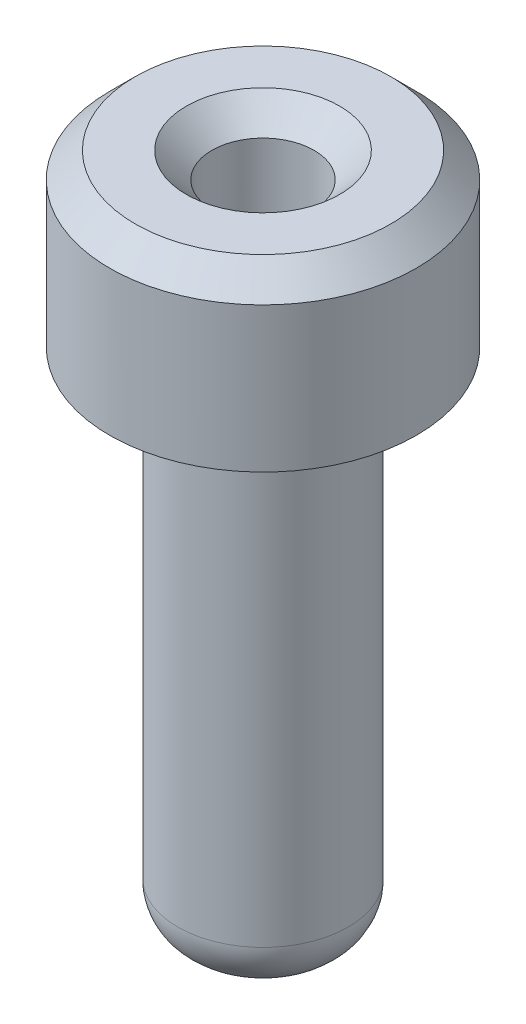
ISO-10303-21;
HEADER;
FILE_DESCRIPTION(('STEP AP214'),'2;1');
FILE_NAME('part.step','',(''),(''),'','','');
FILE_SCHEMA(('AUTOMOTIVE_DESIGN { 1 0 10303 214 1 1 1 1 }'));
ENDSEC;
DATA;
#1=APPLICATION_CONTEXT('core data for automotive mechanical design processes');
#2=APPLICATION_PROTOCOL_DEFINITION('international standard','automotive_design',2000,#1);
#3=PRODUCT_CONTEXT('',#1,'mechanical');
#4=PRODUCT('Part','Part','',(#3));
#5=PRODUCT_RELATED_PRODUCT_CATEGORY('part','',(#4));
#6=PRODUCT_DEFINITION_FORMATION('','',#4);
#7=PRODUCT_DEFINITION_CONTEXT('part definition',#1,'design');
#8=PRODUCT_DEFINITION('design','',#6,#7);
#9=PRODUCT_DEFINITION_SHAPE('','',#8);
#10=(LENGTH_UNIT() NAMED_UNIT(*) SI_UNIT(.MILLI.,.METRE.));
#11=(NAMED_UNIT(*) PLANE_ANGLE_UNIT() SI_UNIT($,.RADIAN.));
#12=(NAMED_UNIT(*) SI_UNIT($,.STERADIAN.) SOLID_ANGLE_UNIT());
#13=UNCERTAINTY_MEASURE_WITH_UNIT(LENGTH_MEASURE(1.E-05),#10,'distance_accuracy_value','');
#14=(GEOMETRIC_REPRESENTATION_CONTEXT(3) GLOBAL_UNCERTAINTY_ASSIGNED_CONTEXT((#13)) GLOBAL_UNIT_ASSIGNED_CONTEXT((#10,
#11,#12)) REPRESENTATION_CONTEXT('',''));
#15=CARTESIAN_POINT('',(0.,0.,0.));
#16=DIRECTION('',(0.,0.,1.));
#17=DIRECTION('',(1.,0.,0.));
#18=AXIS2_PLACEMENT_3D('',#15,#16,#17);
#19=CARTESIAN_POINT('',(0.9,-4.,0.));
#20=DIRECTION('',(0.,-1.,0.));
#21=DIRECTION('',(0.,0.,-1.));
#22=AXIS2_PLACEMENT_3D('',#19,#20,#21);
#23=PLANE('',#22);
#24=CARTESIAN_POINT('',(0.9,-4.,0.));
#25=DIRECTION('',(0.,-1.,0.));
#26=DIRECTION('',(-1.,0.,0.));
#27=AXIS2_PLACEMENT_3D('',#24,#25,#26);
#28=CIRCLE('',#27,0.2);
#29=CARTESIAN_POINT('',(0.900000000000413,-4.,-0.2));
#30=VERTEX_POINT('',#29);
#31=EDGE_CURVE('E11',#30,#30,#28,.T.);
#32=ORIENTED_EDGE('',*,*,#31,.T.);
#33=EDGE_LOOP('',(#32));
#34=FACE_BOUND('',#33,.T.);
#35=ADVANCED_FACE('F17',(#34),#23,.T.);
#36=CARTESIAN_POINT('',(0.900000000000413,-4.0000000000002,-0.199999999999386));
#37=CARTESIAN_POINT('',(0.700000000000896,-4.00000000000039,-0.199999999999386));
#38=CARTESIAN_POINT('',(0.700000000000896,-4.00000000000042,1.31884857368891E-13));
#39=CARTESIAN_POINT('',(0.700000000000896,-4.00000000000044,0.199999999999649));
#40=CARTESIAN_POINT('',(0.900000000000413,-4.00000000000025,0.19999999999965));
#41=CARTESIAN_POINT('',(1.09999999999993,-4.00000000000006,0.199999999999649));
#42=CARTESIAN_POINT('',(1.09999999999993,-4.,1.31884857368941E-13));
#43=CARTESIAN_POINT('',(1.09999999999993,-4.00000000000001,-0.199999999999386));
#44=CARTESIAN_POINT('',(0.900000000000413,-4.0000000000002,-0.199999999999386));
#45=CARTESIAN_POINT('',(0.900000000000413,-4.00000000000058,-0.500000000000546));
#46=CARTESIAN_POINT('',(0.399999999999736,-4.00000000000106,-0.500000000000545));
#47=CARTESIAN_POINT('',(0.399999999999736,-4.00000000000113,1.31884857368798E-13));
#48=CARTESIAN_POINT('',(0.399999999999736,-4.00000000000119,0.500000000000809));
#49=CARTESIAN_POINT('',(0.900000000000413,-4.00000000000071,0.500000000000809));
#50=CARTESIAN_POINT('',(1.40000000000109,-4.00000000000024,0.500000000000809));
#51=CARTESIAN_POINT('',(1.40000000000109,-4.00000000000017,1.31884857368924E-13));
#52=CARTESIAN_POINT('',(1.40000000000109,-4.0000000000001,-0.500000000000545));
#53=CARTESIAN_POINT('',(0.900000000000413,-4.00000000000058,-0.500000000000546));
#54=CARTESIAN_POINT('',(0.900000000000126,-3.69999999999942,-0.500000000000018));
#55=CARTESIAN_POINT('',(0.399999999999937,-3.6999999999999,-0.500000000000018));
#56=CARTESIAN_POINT('',(0.399999999999937,-3.7,1.71043734731314E-13));
#57=CARTESIAN_POINT('',(0.399999999999937,-3.70000000000003,0.50000000000036));
#58=CARTESIAN_POINT('',(0.900000000000126,-3.69999999999955,0.500000000000361));
#59=CARTESIAN_POINT('',(1.40000000000032,-3.69999999999908,0.50000000000036));
#60=CARTESIAN_POINT('',(1.40000000000032,-3.69999999999901,1.7104373473144E-13));
#61=CARTESIAN_POINT('',(1.40000000000032,-3.69999999999894,-0.500000000000018));
#62=CARTESIAN_POINT('',(0.900000000000126,-3.69999999999942,-0.500000000000018));
#63=(BOUNDED_SURFACE() B_SPLINE_SURFACE(2,2,((#36,#37,#38,#39,#40,#41,#42,#43,#44),(#45,#46,#47,
#48,#49,#50,#51,#52,#53),(#54,#55,#56,#57,#58,#59,#60,#61,#62)),.UNSPECIFIED.,.F.,.T.,
.F.) B_SPLINE_SURFACE_WITH_KNOTS((3,3),(3,2,2,2,3),(-1.5707963267963,1.62738730608672E-12),
(-3.14159265358979,-1.5707963267949,0.,1.5707963267949,3.14159265358979),
.UNSPECIFIED.) GEOMETRIC_REPRESENTATION_ITEM() RATIONAL_B_SPLINE_SURFACE(((1.,0.707106781186548,
1.,0.707106781186548,1.,0.707106781186548,1.,0.707106781186548,1.),(0.70710678118548,
0.499999999999245,0.70710678118548,0.499999999999245,0.70710678118548,0.499999999999245,
0.70710678118548,0.499999999999245,0.70710678118548),(1.,0.707106781186548,1.,0.707106781186548,
1.,0.707106781186548,1.,0.707106781186548,1.))) REPRESENTATION_ITEM('') SURFACE());
#64=CARTESIAN_POINT('',(0.9,-3.7,0.));
#65=DIRECTION('',(0.,-1.,0.));
#66=DIRECTION('',(-1.,0.,0.));
#67=AXIS2_PLACEMENT_3D('',#64,#65,#66);
#68=CIRCLE('',#67,0.5);
#69=CARTESIAN_POINT('',(1.4,-3.7,0.));
#70=VERTEX_POINT('',#69);
#71=CARTESIAN_POINT('',(0.900000000000126,-3.7,-0.5));
#72=VERTEX_POINT('',#71);
#73=EDGE_CURVE('E120',#70,#72,#68,.T.);
#74=CARTESIAN_POINT('',(0.900000000000126,-3.69999999999995,-0.199999999999768));
#75=DIRECTION('',(-1.,-9.55879451963443E-13,0.));
#76=DIRECTION('',(0.,1.31006316905719E-13,-1.));
#77=AXIS2_PLACEMENT_3D('',#74,#75,#76);
#78=CIRCLE('',#77,0.30000000000025);
#79=EDGE_CURVE('E27',#72,#30,#78,.T.);
#80=CARTESIAN_POINT('',(0.9,-3.7,0.));
#81=DIRECTION('',(0.,-1.,0.));
#82=DIRECTION('',(-1.,0.,0.));
#83=AXIS2_PLACEMENT_3D('',#80,#81,#82);
#84=CIRCLE('',#83,0.5);
#85=EDGE_CURVE('E101',#72,#70,#84,.T.);
#86=ORIENTED_EDGE('',*,*,#73,.T.);
#87=ORIENTED_EDGE('',*,*,#79,.T.);
#88=ORIENTED_EDGE('',*,*,#31,.F.);
#89=ORIENTED_EDGE('',*,*,#79,.F.);
#90=ORIENTED_EDGE('',*,*,#85,.T.);
#91=EDGE_LOOP('',(#86,#87,#88,#89,#90));
#92=FACE_BOUND('',#91,.T.);
#93=ADVANCED_FACE('F153',(#92),#63,.F.);
#94=CARTESIAN_POINT('',(0.9,0.2,0.));
#95=DIRECTION('',(0.,-1.,0.));
#96=DIRECTION('',(-1.,0.,0.));
#97=AXIS2_PLACEMENT_3D('',#94,#95,#96);
#98=CYLINDRICAL_SURFACE('',#97,0.5);
#99=ORIENTED_EDGE('',*,*,#73,.F.);
#100=DIRECTION('',(0.,1.,0.));
#101=VECTOR('',#100,1.);
#102=CARTESIAN_POINT('',(1.4,0.2,0.));
#103=LINE('',#102,#101);
#104=CARTESIAN_POINT('',(1.4,-1.,0.));
#105=VERTEX_POINT('',#104);
#106=EDGE_CURVE('E124',#70,#105,#103,.T.);
#107=ORIENTED_EDGE('',*,*,#106,.T.);
#108=CARTESIAN_POINT('',(0.9,-1.,0.));
#109=DIRECTION('',(0.,-1.,0.));
#110=DIRECTION('',(-1.,0.,0.));
#111=AXIS2_PLACEMENT_3D('',#108,#109,#110);
#112=CIRCLE('',#111,0.5);
#113=EDGE_CURVE('E114',#105,#105,#112,.T.);
#114=ORIENTED_EDGE('',*,*,#113,.T.);
#115=ORIENTED_EDGE('',*,*,#106,.F.);
#116=ORIENTED_EDGE('',*,*,#85,.F.);
#117=EDGE_LOOP('',(#99,#107,#114,#115,#116));
#118=FACE_BOUND('',#117,.T.);
#119=ADVANCED_FACE('F158',(#118),#98,.T.);
#120=CARTESIAN_POINT('',(0.9,-1.,0.));
#121=DIRECTION('',(0.,-1.,0.));
#122=DIRECTION('',(0.,0.,-1.));
#123=AXIS2_PLACEMENT_3D('',#120,#121,#122);
#124=PLANE('',#123);
#125=ORIENTED_EDGE('',*,*,#113,.F.);
#126=EDGE_LOOP('',(#125));
#127=FACE_BOUND('',#126,.T.);
#128=CARTESIAN_POINT('',(0.9,-1.,0.));
#129=DIRECTION('',(0.,1.,0.));
#130=DIRECTION('',(-1.,0.,0.));
#131=AXIS2_PLACEMENT_3D('',#128,#129,#130);
#132=CIRCLE('',#131,0.9);
#133=CARTESIAN_POINT('',(1.8,-1.,0.));
#134=VERTEX_POINT('',#133);
#135=EDGE_CURVE('E86',#134,#134,#132,.T.);
#136=ORIENTED_EDGE('',*,*,#135,.F.);
#137=EDGE_LOOP('',(#136));
#138=FACE_BOUND('',#137,.T.);
#139=ADVANCED_FACE('F161',(#127,#138),#124,.T.);
#140=CARTESIAN_POINT('',(0.9,-3.195331965159,0.));
#141=DIRECTION('',(0.,-1.,0.));
#142=DIRECTION('',(0.,0.,-1.));
#143=AXIS2_PLACEMENT_3D('',#140,#141,#142);
#144=PLANE('',#143);
#145=CARTESIAN_POINT('',(0.9,-3.195331965159,0.));
#146=DIRECTION('',(0.,-1.,0.));
#147=DIRECTION('',(-1.,0.,0.));
#148=AXIS2_PLACEMENT_3D('',#145,#146,#147);
#149=CIRCLE('',#148,0.3);
#150=CARTESIAN_POINT('',(1.2,-3.195331965159,0.));
#151=VERTEX_POINT('',#150);
#152=EDGE_CURVE('E111',#151,#151,#149,.T.);
#153=ORIENTED_EDGE('',*,*,#152,.F.);
#154=EDGE_LOOP('',(#153));
#155=FACE_BOUND('',#154,.T.);
#156=ADVANCED_FACE('F164',(#155),#144,.F.);
#157=CARTESIAN_POINT('',(0.9,0.2,0.));
#158=DIRECTION('',(0.,-1.,0.));
#159=DIRECTION('',(-1.,0.,0.));
#160=AXIS2_PLACEMENT_3D('',#157,#158,#159);
#161=CYLINDRICAL_SURFACE('',#160,0.3);
#162=CARTESIAN_POINT('',(0.9,-0.15,0.));
#163=DIRECTION('',(0.,-1.,0.));
#164=DIRECTION('',(-1.,0.,0.));
#165=AXIS2_PLACEMENT_3D('',#162,#163,#164);
#166=CIRCLE('',#165,0.3);
#167=CARTESIAN_POINT('',(1.2,-0.15,0.));
#168=VERTEX_POINT('',#167);
#169=CARTESIAN_POINT('',(0.6,-0.15,0.));
#170=VERTEX_POINT('',#169);
#171=EDGE_CURVE('E115',#168,#170,#166,.T.);
#172=ORIENTED_EDGE('',*,*,#171,.F.);
#173=DIRECTION('',(0.,-1.,0.));
#174=VECTOR('',#173,1.);
#175=CARTESIAN_POINT('',(1.2,0.2,0.));
#176=LINE('',#175,#174);
#177=EDGE_CURVE('E106',#168,#151,#176,.T.);
#178=ORIENTED_EDGE('',*,*,#177,.T.);
#179=ORIENTED_EDGE('',*,*,#152,.T.);
#180=ORIENTED_EDGE('',*,*,#177,.F.);
#181=CARTESIAN_POINT('',(0.9,-0.15,0.));
#182=DIRECTION('',(0.,-1.,0.));
#183=DIRECTION('',(-1.,0.,0.));
#184=AXIS2_PLACEMENT_3D('',#181,#182,#183);
#185=CIRCLE('',#184,0.3);
#186=EDGE_CURVE('E102',#170,#168,#185,.T.);
#187=ORIENTED_EDGE('',*,*,#186,.F.);
#188=EDGE_LOOP('',(#172,#178,#179,#180,#187));
#189=FACE_BOUND('',#188,.T.);
#190=ADVANCED_FACE('F166',(#189),#161,.F.);
#191=CARTESIAN_POINT('',(0.9,-0.075,0.));
#192=DIRECTION('',(0.,1.,0.));
#193=DIRECTION('',(1.,0.,0.));
#194=AXIS2_PLACEMENT_3D('',#191,#192,#193);
#195=CONICAL_SURFACE('',#194,0.375,0.785398163397448);
#196=ORIENTED_EDGE('',*,*,#171,.T.);
#197=DIRECTION('',(-0.707106781186548,0.707106781186548,0.));
#198=VECTOR('',#197,1.);
#199=CARTESIAN_POINT('',(0.525,-0.075,0.));
#200=LINE('',#199,#198);
#201=CARTESIAN_POINT('',(0.45,0.,0.));
#202=VERTEX_POINT('',#201);
#203=EDGE_CURVE('E107',#170,#202,#200,.T.);
#204=ORIENTED_EDGE('',*,*,#203,.T.);
#205=CARTESIAN_POINT('',(0.9,0.,0.));
#206=DIRECTION('',(0.,-1.,0.));
#207=DIRECTION('',(-1.,0.,0.));
#208=AXIS2_PLACEMENT_3D('',#205,#206,#207);
#209=CIRCLE('',#208,0.45);
#210=EDGE_CURVE('E119',#202,#202,#209,.T.);
#211=ORIENTED_EDGE('',*,*,#210,.F.);
#212=ORIENTED_EDGE('',*,*,#203,.F.);
#213=ORIENTED_EDGE('',*,*,#186,.T.);
#214=EDGE_LOOP('',(#196,#204,#211,#212,#213));
#215=FACE_BOUND('',#214,.T.);
#216=ADVANCED_FACE('F19',(#215),#195,.F.);
#217=CARTESIAN_POINT('',(0.9,0.,0.));
#218=DIRECTION('',(0.,-1.,0.));
#219=DIRECTION('',(0.,0.,-1.));
#220=AXIS2_PLACEMENT_3D('',#217,#218,#219);
#221=PLANE('',#220);
#222=ORIENTED_EDGE('',*,*,#210,.T.);
#223=EDGE_LOOP('',(#222));
#224=FACE_BOUND('',#223,.T.);
#225=CARTESIAN_POINT('',(0.9,0.,0.));
#226=DIRECTION('',(0.,1.,0.));
#227=DIRECTION('',(-1.,0.,0.));
#228=AXIS2_PLACEMENT_3D('',#225,#226,#227);
#229=CIRCLE('',#228,0.75);
#230=CARTESIAN_POINT('',(0.15,0.,0.));
#231=VERTEX_POINT('',#230);
#232=EDGE_CURVE('E21',#231,#231,#229,.T.);
#233=ORIENTED_EDGE('',*,*,#232,.T.);
#234=EDGE_LOOP('',(#233));
#235=FACE_BOUND('',#234,.T.);
#236=ADVANCED_FACE('F140',(#224,#235),#221,.F.);
#237=CARTESIAN_POINT('',(0.9,-0.0750000000000013,0.));
#238=DIRECTION('',(0.,-1.,0.));
#239=DIRECTION('',(-1.,0.,0.));
#240=AXIS2_PLACEMENT_3D('',#237,#238,#239);
#241=CONICAL_SURFACE('',#240,0.825,0.785398163397448);
#242=ORIENTED_EDGE('',*,*,#232,.F.);
#243=EDGE_LOOP('',(#242));
#244=FACE_BOUND('',#243,.T.);
#245=CARTESIAN_POINT('',(0.9,-0.15,0.));
#246=DIRECTION('',(0.,-1.,0.));
#247=DIRECTION('',(-1.,0.,0.));
#248=AXIS2_PLACEMENT_3D('',#245,#246,#247);
#249=CIRCLE('',#248,0.9);
#250=CARTESIAN_POINT('',(1.8,-0.15,0.));
#251=VERTEX_POINT('',#250);
#252=EDGE_CURVE('E88',#251,#251,#249,.T.);
#253=ORIENTED_EDGE('',*,*,#252,.F.);
#254=EDGE_LOOP('',(#253));
#255=FACE_BOUND('',#254,.T.);
#256=ADVANCED_FACE('F142',(#244,#255),#241,.T.);
#257=CARTESIAN_POINT('',(0.9,0.2,0.));
#258=DIRECTION('',(0.,-1.,0.));
#259=DIRECTION('',(-1.,0.,0.));
#260=AXIS2_PLACEMENT_3D('',#257,#258,#259);
#261=CYLINDRICAL_SURFACE('',#260,0.9);
#262=ORIENTED_EDGE('',*,*,#135,.T.);
#263=DIRECTION('',(0.,1.,0.));
#264=VECTOR('',#263,1.);
#265=CARTESIAN_POINT('',(1.8,0.2,0.));
#266=LINE('',#265,#264);
#267=EDGE_CURVE('E83',#134,#251,#266,.T.);
#268=ORIENTED_EDGE('',*,*,#267,.T.);
#269=ORIENTED_EDGE('',*,*,#252,.T.);
#270=ORIENTED_EDGE('',*,*,#267,.F.);
#271=EDGE_LOOP('',(#262,#268,#269,#270));
#272=FACE_BOUND('',#271,.T.);
#273=ADVANCED_FACE('F84',(#272),#261,.T.);
#274=CLOSED_SHELL('',(#35,#93,#119,#139,#156,#190,#216,#236,#256,#273));
#275=MANIFOLD_SOLID_BREP('B1',#274);
#276=ADVANCED_BREP_SHAPE_REPRESENTATION('',(#18,#275),#14);
#277=SHAPE_DEFINITION_REPRESENTATION(#9,#276);
ENDSEC;
END-ISO-10303-21;
